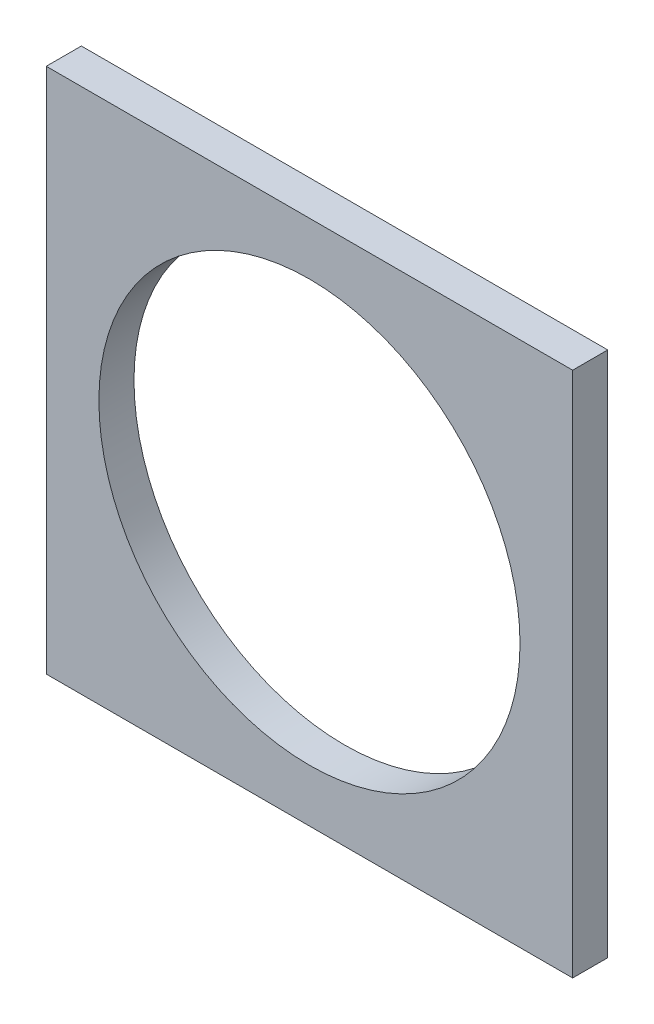
ISO-10303-21;
HEADER;
FILE_DESCRIPTION(('STEP AP214'),'2;1');
FILE_NAME('part.step','',(''),(''),'','','');
FILE_SCHEMA(('AUTOMOTIVE_DESIGN { 1 0 10303 214 1 1 1 1 }'));
ENDSEC;
DATA;
#1=APPLICATION_CONTEXT('core data for automotive mechanical design processes');
#2=APPLICATION_PROTOCOL_DEFINITION('international standard','automotive_design',2000,#1);
#3=PRODUCT_CONTEXT('',#1,'mechanical');
#4=PRODUCT('Part','Part','',(#3));
#5=PRODUCT_RELATED_PRODUCT_CATEGORY('part','',(#4));
#6=PRODUCT_DEFINITION_FORMATION('','',#4);
#7=PRODUCT_DEFINITION_CONTEXT('part definition',#1,'design');
#8=PRODUCT_DEFINITION('design','',#6,#7);
#9=PRODUCT_DEFINITION_SHAPE('','',#8);
#10=(LENGTH_UNIT() NAMED_UNIT(*) SI_UNIT(.MILLI.,.METRE.));
#11=(NAMED_UNIT(*) PLANE_ANGLE_UNIT() SI_UNIT($,.RADIAN.));
#12=(NAMED_UNIT(*) SI_UNIT($,.STERADIAN.) SOLID_ANGLE_UNIT());
#13=UNCERTAINTY_MEASURE_WITH_UNIT(LENGTH_MEASURE(1.E-05),#10,'distance_accuracy_value','');
#14=(GEOMETRIC_REPRESENTATION_CONTEXT(3) GLOBAL_UNCERTAINTY_ASSIGNED_CONTEXT((#13)) GLOBAL_UNIT_ASSIGNED_CONTEXT((#10,
#11,#12)) REPRESENTATION_CONTEXT('',''));
#15=CARTESIAN_POINT('',(0.,0.,0.));
#16=DIRECTION('',(0.,0.,1.));
#17=DIRECTION('',(1.,0.,0.));
#18=AXIS2_PLACEMENT_3D('',#15,#16,#17);
#19=CARTESIAN_POINT('',(0.,0.,2.));
#20=DIRECTION('',(0.,0.,1.));
#21=DIRECTION('',(1.,0.,0.));
#22=AXIS2_PLACEMENT_3D('',#19,#20,#21);
#23=PLANE('',#22);
#24=DIRECTION('',(0.,1.,0.));
#25=VECTOR('',#24,1.);
#26=CARTESIAN_POINT('',(15.,15.,2.));
#27=LINE('',#26,#25);
#28=CARTESIAN_POINT('',(15.,-15.,2.));
#29=VERTEX_POINT('',#28);
#30=CARTESIAN_POINT('',(15.,15.,2.));
#31=VERTEX_POINT('',#30);
#32=EDGE_CURVE('E92',#29,#31,#27,.T.);
#33=ORIENTED_EDGE('',*,*,#32,.T.);
#34=DIRECTION('',(-1.,0.,0.));
#35=VECTOR('',#34,1.);
#36=CARTESIAN_POINT('',(-15.,15.,2.));
#37=LINE('',#36,#35);
#38=CARTESIAN_POINT('',(-15.,15.,2.));
#39=VERTEX_POINT('',#38);
#40=EDGE_CURVE('E87',#31,#39,#37,.T.);
#41=ORIENTED_EDGE('',*,*,#40,.T.);
#42=DIRECTION('',(0.,-1.,0.));
#43=VECTOR('',#42,1.);
#44=CARTESIAN_POINT('',(-15.,15.,2.));
#45=LINE('',#44,#43);
#46=CARTESIAN_POINT('',(-15.,-15.,2.));
#47=VERTEX_POINT('',#46);
#48=EDGE_CURVE('E90',#39,#47,#45,.T.);
#49=ORIENTED_EDGE('',*,*,#48,.T.);
#50=DIRECTION('',(1.,0.,0.));
#51=VECTOR('',#50,1.);
#52=CARTESIAN_POINT('',(-15.,-15.,2.));
#53=LINE('',#52,#51);
#54=EDGE_CURVE('E57',#47,#29,#53,.T.);
#55=ORIENTED_EDGE('',*,*,#54,.T.);
#56=EDGE_LOOP('',(#33,#41,#49,#55));
#57=FACE_BOUND('',#56,.T.);
#58=CARTESIAN_POINT('',(0.,0.,2.));
#59=DIRECTION('',(0.,0.,1.));
#60=DIRECTION('',(1.,0.,0.));
#61=AXIS2_PLACEMENT_3D('',#58,#59,#60);
#62=CIRCLE('',#61,12.);
#63=CARTESIAN_POINT('',(12.,0.,2.));
#64=VERTEX_POINT('',#63);
#65=EDGE_CURVE('E112',#64,#64,#62,.T.);
#66=ORIENTED_EDGE('',*,*,#65,.F.);
#67=EDGE_LOOP('',(#66));
#68=FACE_BOUND('',#67,.T.);
#69=ADVANCED_FACE('F39',(#57,#68),#23,.T.);
#70=CARTESIAN_POINT('',(0.,0.,0.));
#71=DIRECTION('',(0.,0.,1.));
#72=DIRECTION('',(1.,0.,0.));
#73=AXIS2_PLACEMENT_3D('',#70,#71,#72);
#74=PLANE('',#73);
#75=DIRECTION('',(0.,1.,0.));
#76=VECTOR('',#75,1.);
#77=CARTESIAN_POINT('',(15.,15.,0.));
#78=LINE('',#77,#76);
#79=CARTESIAN_POINT('',(15.,-15.,0.));
#80=VERTEX_POINT('',#79);
#81=CARTESIAN_POINT('',(15.,15.,0.));
#82=VERTEX_POINT('',#81);
#83=EDGE_CURVE('E108',#80,#82,#78,.T.);
#84=ORIENTED_EDGE('',*,*,#83,.F.);
#85=DIRECTION('',(1.,0.,0.));
#86=VECTOR('',#85,1.);
#87=CARTESIAN_POINT('',(-15.,-15.,0.));
#88=LINE('',#87,#86);
#89=CARTESIAN_POINT('',(-15.,-15.,0.));
#90=VERTEX_POINT('',#89);
#91=EDGE_CURVE('E80',#90,#80,#88,.T.);
#92=ORIENTED_EDGE('',*,*,#91,.F.);
#93=DIRECTION('',(0.,-1.,0.));
#94=VECTOR('',#93,1.);
#95=CARTESIAN_POINT('',(-15.,15.,0.));
#96=LINE('',#95,#94);
#97=CARTESIAN_POINT('',(-15.,15.,0.));
#98=VERTEX_POINT('',#97);
#99=EDGE_CURVE('E74',#98,#90,#96,.T.);
#100=ORIENTED_EDGE('',*,*,#99,.F.);
#101=DIRECTION('',(-1.,0.,0.));
#102=VECTOR('',#101,1.);
#103=CARTESIAN_POINT('',(-15.,15.,0.));
#104=LINE('',#103,#102);
#105=EDGE_CURVE('E97',#82,#98,#104,.T.);
#106=ORIENTED_EDGE('',*,*,#105,.F.);
#107=EDGE_LOOP('',(#84,#92,#100,#106));
#108=FACE_BOUND('',#107,.T.);
#109=CARTESIAN_POINT('',(0.,0.,0.));
#110=DIRECTION('',(0.,0.,1.));
#111=DIRECTION('',(1.,0.,0.));
#112=AXIS2_PLACEMENT_3D('',#109,#110,#111);
#113=CIRCLE('',#112,12.);
#114=CARTESIAN_POINT('',(12.,0.,0.));
#115=VERTEX_POINT('',#114);
#116=EDGE_CURVE('E130',#115,#115,#113,.T.);
#117=ORIENTED_EDGE('',*,*,#116,.T.);
#118=EDGE_LOOP('',(#117));
#119=FACE_BOUND('',#118,.T.);
#120=ADVANCED_FACE('F125',(#108,#119),#74,.F.);
#121=CARTESIAN_POINT('',(15.,15.,2.));
#122=DIRECTION('',(-1.,0.,0.));
#123=DIRECTION('',(0.,-1.,0.));
#124=AXIS2_PLACEMENT_3D('',#121,#122,#123);
#125=PLANE('',#124);
#126=ORIENTED_EDGE('',*,*,#83,.T.);
#127=DIRECTION('',(0.,0.,-1.));
#128=VECTOR('',#127,1.);
#129=CARTESIAN_POINT('',(15.,15.,2.));
#130=LINE('',#129,#128);
#131=EDGE_CURVE('E11',#31,#82,#130,.T.);
#132=ORIENTED_EDGE('',*,*,#131,.F.);
#133=ORIENTED_EDGE('',*,*,#32,.F.);
#134=DIRECTION('',(0.,0.,-1.));
#135=VECTOR('',#134,1.);
#136=CARTESIAN_POINT('',(15.,-15.,2.));
#137=LINE('',#136,#135);
#138=EDGE_CURVE('E104',#29,#80,#137,.T.);
#139=ORIENTED_EDGE('',*,*,#138,.T.);
#140=EDGE_LOOP('',(#126,#132,#133,#139));
#141=FACE_BOUND('',#140,.T.);
#142=ADVANCED_FACE('F41',(#141),#125,.F.);
#143=CARTESIAN_POINT('',(-15.,15.,2.));
#144=DIRECTION('',(0.,-1.,0.));
#145=DIRECTION('',(0.,0.,-1.));
#146=AXIS2_PLACEMENT_3D('',#143,#144,#145);
#147=PLANE('',#146);
#148=ORIENTED_EDGE('',*,*,#105,.T.);
#149=DIRECTION('',(0.,0.,-1.));
#150=VECTOR('',#149,1.);
#151=CARTESIAN_POINT('',(-15.,15.,2.));
#152=LINE('',#151,#150);
#153=EDGE_CURVE('E49',#39,#98,#152,.T.);
#154=ORIENTED_EDGE('',*,*,#153,.F.);
#155=ORIENTED_EDGE('',*,*,#40,.F.);
#156=ORIENTED_EDGE('',*,*,#131,.T.);
#157=EDGE_LOOP('',(#148,#154,#155,#156));
#158=FACE_BOUND('',#157,.T.);
#159=ADVANCED_FACE('F96',(#158),#147,.F.);
#160=CARTESIAN_POINT('',(-15.,15.,2.));
#161=DIRECTION('',(1.,0.,0.));
#162=DIRECTION('',(0.,0.,-1.));
#163=AXIS2_PLACEMENT_3D('',#160,#161,#162);
#164=PLANE('',#163);
#165=ORIENTED_EDGE('',*,*,#99,.T.);
#166=DIRECTION('',(0.,0.,-1.));
#167=VECTOR('',#166,1.);
#168=CARTESIAN_POINT('',(-15.,-15.,2.));
#169=LINE('',#168,#167);
#170=EDGE_CURVE('E99',#47,#90,#169,.T.);
#171=ORIENTED_EDGE('',*,*,#170,.F.);
#172=ORIENTED_EDGE('',*,*,#48,.F.);
#173=ORIENTED_EDGE('',*,*,#153,.T.);
#174=EDGE_LOOP('',(#165,#171,#172,#173));
#175=FACE_BOUND('',#174,.T.);
#176=ADVANCED_FACE('F100',(#175),#164,.F.);
#177=CARTESIAN_POINT('',(-15.,-15.,2.));
#178=DIRECTION('',(0.,1.,0.));
#179=DIRECTION('',(0.,0.,1.));
#180=AXIS2_PLACEMENT_3D('',#177,#178,#179);
#181=PLANE('',#180);
#182=ORIENTED_EDGE('',*,*,#91,.T.);
#183=ORIENTED_EDGE('',*,*,#138,.F.);
#184=ORIENTED_EDGE('',*,*,#54,.F.);
#185=ORIENTED_EDGE('',*,*,#170,.T.);
#186=EDGE_LOOP('',(#182,#183,#184,#185));
#187=FACE_BOUND('',#186,.T.);
#188=ADVANCED_FACE('F122',(#187),#181,.F.);
#189=CARTESIAN_POINT('',(0.,0.,2.));
#190=DIRECTION('',(0.,0.,-1.));
#191=DIRECTION('',(-1.,0.,0.));
#192=AXIS2_PLACEMENT_3D('',#189,#190,#191);
#193=CYLINDRICAL_SURFACE('',#192,12.);
#194=ORIENTED_EDGE('',*,*,#65,.T.);
#195=EDGE_LOOP('',(#194));
#196=FACE_BOUND('',#195,.T.);
#197=ORIENTED_EDGE('',*,*,#116,.F.);
#198=EDGE_LOOP('',(#197));
#199=FACE_BOUND('',#198,.T.);
#200=ADVANCED_FACE('F138',(#196,#199),#193,.F.);
#201=CLOSED_SHELL('',(#69,#120,#142,#159,#176,#188,#200));
#202=MANIFOLD_SOLID_BREP('B2',#201);
#203=ADVANCED_BREP_SHAPE_REPRESENTATION('',(#18,#202),#14);
#204=SHAPE_DEFINITION_REPRESENTATION(#9,#203);
ENDSEC;
END-ISO-10303-21;
